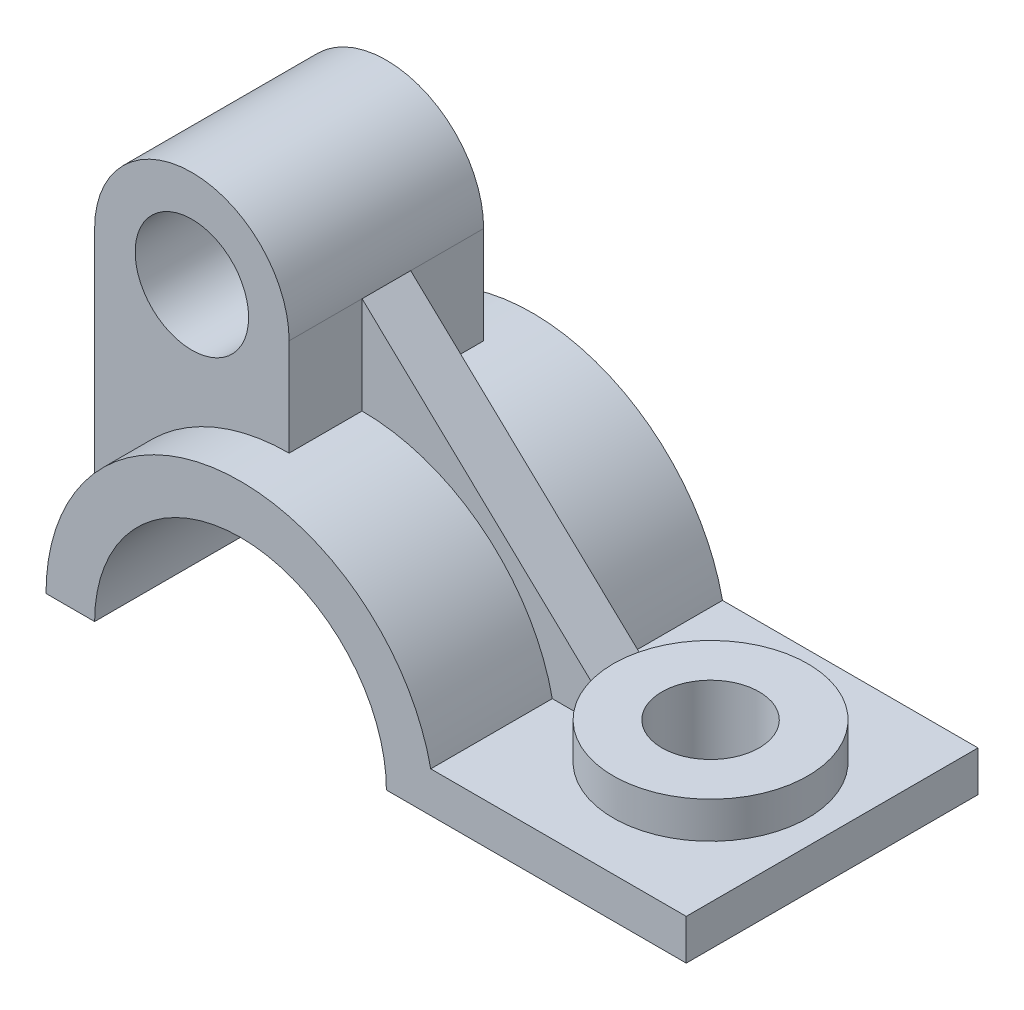
ISO-10303-21;
HEADER;
FILE_DESCRIPTION(('STEP AP214'),'2;1');
FILE_NAME('part.step','',(''),(''),'','','');
FILE_SCHEMA(('AUTOMOTIVE_DESIGN { 1 0 10303 214 1 1 1 1 }'));
ENDSEC;
DATA;
#1=APPLICATION_CONTEXT('core data for automotive mechanical design processes');
#2=APPLICATION_PROTOCOL_DEFINITION('international standard','automotive_design',2000,#1);
#3=PRODUCT_CONTEXT('',#1,'mechanical');
#4=PRODUCT('Part','Part','',(#3));
#5=PRODUCT_RELATED_PRODUCT_CATEGORY('part','',(#4));
#6=PRODUCT_DEFINITION_FORMATION('','',#4);
#7=PRODUCT_DEFINITION_CONTEXT('part definition',#1,'design');
#8=PRODUCT_DEFINITION('design','',#6,#7);
#9=PRODUCT_DEFINITION_SHAPE('','',#8);
#10=(LENGTH_UNIT() NAMED_UNIT(*) SI_UNIT(.MILLI.,.METRE.));
#11=(NAMED_UNIT(*) PLANE_ANGLE_UNIT() SI_UNIT($,.RADIAN.));
#12=(NAMED_UNIT(*) SI_UNIT($,.STERADIAN.) SOLID_ANGLE_UNIT());
#13=UNCERTAINTY_MEASURE_WITH_UNIT(LENGTH_MEASURE(1.E-05),#10,'distance_accuracy_value','');
#14=(GEOMETRIC_REPRESENTATION_CONTEXT(3) GLOBAL_UNCERTAINTY_ASSIGNED_CONTEXT((#13)) GLOBAL_UNIT_ASSIGNED_CONTEXT((#10,
#11,#12)) REPRESENTATION_CONTEXT('',''));
#15=CARTESIAN_POINT('',(0.,0.,0.));
#16=DIRECTION('',(0.,0.,1.));
#17=DIRECTION('',(1.,0.,0.));
#18=AXIS2_PLACEMENT_3D('',#15,#16,#17);
#19=CARTESIAN_POINT('',(0.,0.,18.));
#20=DIRECTION('',(0.,0.,-1.));
#21=DIRECTION('',(-1.,0.,0.));
#22=AXIS2_PLACEMENT_3D('',#19,#20,#21);
#23=CYLINDRICAL_SURFACE('',#22,24.);
#24=CARTESIAN_POINT('',(0.,0.,-3.));
#25=DIRECTION('',(0.,0.,1.));
#26=DIRECTION('',(1.,0.,0.));
#27=AXIS2_PLACEMENT_3D('',#24,#25,#26);
#28=CIRCLE('',#27,24.);
#29=CARTESIAN_POINT('',(23.473389188611,5.00000000000001,-3.));
#30=VERTEX_POINT('',#29);
#31=CARTESIAN_POINT('',(0.,24.,-3.));
#32=VERTEX_POINT('',#31);
#33=EDGE_CURVE('E60',#30,#32,#28,.T.);
#34=ORIENTED_EDGE('',*,*,#33,.F.);
#35=DIRECTION('',(0.,0.,-1.));
#36=VECTOR('',#35,1.);
#37=CARTESIAN_POINT('',(23.473389188611,5.00000000000001,18.));
#38=LINE('',#37,#36);
#39=CARTESIAN_POINT('',(23.473389188611,5.00000000000001,-18.));
#40=VERTEX_POINT('',#39);
#41=EDGE_CURVE('E166',#30,#40,#38,.T.);
#42=ORIENTED_EDGE('',*,*,#41,.T.);
#43=CARTESIAN_POINT('',(0.,0.,-18.));
#44=DIRECTION('',(0.,0.,1.));
#45=DIRECTION('',(1.,0.,0.));
#46=AXIS2_PLACEMENT_3D('',#43,#44,#45);
#47=CIRCLE('',#46,24.);
#48=CARTESIAN_POINT('',(-24.,0.,-18.));
#49=VERTEX_POINT('',#48);
#50=EDGE_CURVE('E203',#40,#49,#47,.T.);
#51=ORIENTED_EDGE('',*,*,#50,.T.);
#52=DIRECTION('',(0.,0.,-1.));
#53=VECTOR('',#52,1.);
#54=CARTESIAN_POINT('',(-24.,0.,18.));
#55=LINE('',#54,#53);
#56=CARTESIAN_POINT('',(-24.,0.,-12.));
#57=VERTEX_POINT('',#56);
#58=EDGE_CURVE('E180',#57,#49,#55,.T.);
#59=ORIENTED_EDGE('',*,*,#58,.F.);
#60=CARTESIAN_POINT('',(0.,0.,-12.));
#61=DIRECTION('',(0.,0.,1.));
#62=DIRECTION('',(1.,0.,0.));
#63=AXIS2_PLACEMENT_3D('',#60,#61,#62);
#64=CIRCLE('',#63,24.);
#65=CARTESIAN_POINT('',(0.,24.,-12.));
#66=VERTEX_POINT('',#65);
#67=EDGE_CURVE('E236',#66,#57,#64,.T.);
#68=ORIENTED_EDGE('',*,*,#67,.F.);
#69=DIRECTION('',(0.,0.,-1.));
#70=VECTOR('',#69,1.);
#71=CARTESIAN_POINT('',(0.,24.,12.));
#72=LINE('',#71,#70);
#73=EDGE_CURVE('E227',#32,#66,#72,.T.);
#74=ORIENTED_EDGE('',*,*,#73,.F.);
#75=EDGE_LOOP('',(#34,#42,#51,#59,#68,#74));
#76=FACE_BOUND('',#75,.T.);
#77=ADVANCED_FACE('F45',(#76),#23,.T.);
#78=CARTESIAN_POINT('',(0.,0.,12.));
#79=DIRECTION('',(1.,0.,0.));
#80=DIRECTION('',(0.,1.,0.));
#81=AXIS2_PLACEMENT_3D('',#78,#79,#80);
#82=PLANE('',#81);
#83=DIRECTION('',(0.,0.,-1.));
#84=VECTOR('',#83,1.);
#85=CARTESIAN_POINT('',(0.,36.,12.));
#86=LINE('',#85,#84);
#87=CARTESIAN_POINT('',(0.,36.,-3.));
#88=VERTEX_POINT('',#87);
#89=CARTESIAN_POINT('',(0.,36.,-12.));
#90=VERTEX_POINT('',#89);
#91=EDGE_CURVE('E231',#88,#90,#86,.T.);
#92=ORIENTED_EDGE('',*,*,#91,.F.);
#93=DIRECTION('',(0.,-1.,0.));
#94=VECTOR('',#93,1.);
#95=CARTESIAN_POINT('',(0.,0.,-3.));
#96=LINE('',#95,#94);
#97=EDGE_CURVE('E271',#88,#32,#96,.T.);
#98=ORIENTED_EDGE('',*,*,#97,.T.);
#99=ORIENTED_EDGE('',*,*,#73,.T.);
#100=DIRECTION('',(0.,-1.,0.));
#101=VECTOR('',#100,1.);
#102=CARTESIAN_POINT('',(0.,0.,-12.));
#103=LINE('',#102,#101);
#104=EDGE_CURVE('E232',#90,#66,#103,.T.);
#105=ORIENTED_EDGE('',*,*,#104,.F.);
#106=EDGE_LOOP('',(#92,#98,#99,#105));
#107=FACE_BOUND('',#106,.T.);
#108=ADVANCED_FACE('F355',(#107),#82,.T.);
#109=CARTESIAN_POINT('',(0.,5.00000000000001,18.));
#110=DIRECTION('',(0.,-1.,0.));
#111=DIRECTION('',(1.,0.,0.));
#112=AXIS2_PLACEMENT_3D('',#109,#110,#111);
#113=PLANE('',#112);
#114=CARTESIAN_POINT('',(40.,5.00000000000002,0.));
#115=DIRECTION('',(0.,-1.,0.));
#116=DIRECTION('',(1.,0.,0.));
#117=AXIS2_PLACEMENT_3D('',#114,#115,#116);
#118=CIRCLE('',#117,12.);
#119=CARTESIAN_POINT('',(28.3810499613777,5.00000000000001,3.));
#120=VERTEX_POINT('',#119);
#121=CARTESIAN_POINT('',(28.3810499613777,5.00000000000002,-3.));
#122=VERTEX_POINT('',#121);
#123=EDGE_CURVE('E155',#120,#122,#118,.F.);
#124=ORIENTED_EDGE('',*,*,#123,.F.);
#125=DIRECTION('',(-1.,0.,0.));
#126=VECTOR('',#125,1.);
#127=CARTESIAN_POINT('',(0.,5.00000000000001,3.));
#128=LINE('',#127,#126);
#129=CARTESIAN_POINT('',(23.473389188611,5.00000000000001,3.));
#130=VERTEX_POINT('',#129);
#131=EDGE_CURVE('E68',#120,#130,#128,.T.);
#132=ORIENTED_EDGE('',*,*,#131,.T.);
#133=CARTESIAN_POINT('',(23.473389188611,5.00000000000001,18.));
#134=VERTEX_POINT('',#133);
#135=EDGE_CURVE('E161',#134,#130,#38,.T.);
#136=ORIENTED_EDGE('',*,*,#135,.F.);
#137=DIRECTION('',(-1.,0.,0.));
#138=VECTOR('',#137,1.);
#139=CARTESIAN_POINT('',(0.,5.00000000000001,18.));
#140=LINE('',#139,#138);
#141=CARTESIAN_POINT('',(55.,5.00000000000002,18.));
#142=VERTEX_POINT('',#141);
#143=EDGE_CURVE('E194',#142,#134,#140,.T.);
#144=ORIENTED_EDGE('',*,*,#143,.F.);
#145=DIRECTION('',(0.,0.,-1.));
#146=VECTOR('',#145,1.);
#147=CARTESIAN_POINT('',(55.,5.00000000000002,18.));
#148=LINE('',#147,#146);
#149=CARTESIAN_POINT('',(55.,5.00000000000002,-18.));
#150=VERTEX_POINT('',#149);
#151=EDGE_CURVE('E188',#142,#150,#148,.T.);
#152=ORIENTED_EDGE('',*,*,#151,.T.);
#153=DIRECTION('',(-1.,0.,0.));
#154=VECTOR('',#153,1.);
#155=CARTESIAN_POINT('',(0.,5.00000000000001,-18.));
#156=LINE('',#155,#154);
#157=EDGE_CURVE('E206',#150,#40,#156,.T.);
#158=ORIENTED_EDGE('',*,*,#157,.T.);
#159=ORIENTED_EDGE('',*,*,#41,.F.);
#160=DIRECTION('',(-1.,0.,0.));
#161=VECTOR('',#160,1.);
#162=CARTESIAN_POINT('',(0.,5.00000000000001,-3.));
#163=LINE('',#162,#161);
#164=EDGE_CURVE('E164',#122,#30,#163,.T.);
#165=ORIENTED_EDGE('',*,*,#164,.F.);
#166=EDGE_LOOP('',(#124,#132,#136,#144,#152,#158,#159,#165));
#167=FACE_BOUND('',#166,.T.);
#168=ADVANCED_FACE('F47',(#167),#113,.F.);
#169=CARTESIAN_POINT('',(0.,0.,3.));
#170=DIRECTION('',(0.,0.,1.));
#171=DIRECTION('',(1.,0.,0.));
#172=AXIS2_PLACEMENT_3D('',#169,#170,#171);
#173=CIRCLE('',#172,24.);
#174=CARTESIAN_POINT('',(0.,24.,3.));
#175=VERTEX_POINT('',#174);
#176=EDGE_CURVE('E268',#130,#175,#173,.T.);
#177=ORIENTED_EDGE('',*,*,#176,.T.);
#178=CARTESIAN_POINT('',(0.,24.,12.));
#179=VERTEX_POINT('',#178);
#180=EDGE_CURVE('E224',#179,#175,#72,.T.);
#181=ORIENTED_EDGE('',*,*,#180,.F.);
#182=CARTESIAN_POINT('',(0.,0.,12.));
#183=DIRECTION('',(0.,0.,1.));
#184=DIRECTION('',(1.,0.,0.));
#185=AXIS2_PLACEMENT_3D('',#182,#183,#184);
#186=CIRCLE('',#185,24.);
#187=CARTESIAN_POINT('',(-24.,0.,12.));
#188=VERTEX_POINT('',#187);
#189=EDGE_CURVE('E252',#179,#188,#186,.T.);
#190=ORIENTED_EDGE('',*,*,#189,.T.);
#191=CARTESIAN_POINT('',(-24.,0.,18.));
#192=VERTEX_POINT('',#191);
#193=EDGE_CURVE('E177',#192,#188,#55,.T.);
#194=ORIENTED_EDGE('',*,*,#193,.F.);
#195=CARTESIAN_POINT('',(0.,0.,18.));
#196=DIRECTION('',(0.,0.,1.));
#197=DIRECTION('',(1.,0.,0.));
#198=AXIS2_PLACEMENT_3D('',#195,#196,#197);
#199=CIRCLE('',#198,24.);
#200=EDGE_CURVE('E217',#134,#192,#199,.T.);
#201=ORIENTED_EDGE('',*,*,#200,.F.);
#202=ORIENTED_EDGE('',*,*,#135,.T.);
#203=EDGE_LOOP('',(#177,#181,#190,#194,#201,#202));
#204=FACE_BOUND('',#203,.T.);
#205=ADVANCED_FACE('F307',(#204),#23,.T.);
#206=CARTESIAN_POINT('',(0.,0.,18.));
#207=DIRECTION('',(0.,1.,0.));
#208=DIRECTION('',(-1.,0.,0.));
#209=AXIS2_PLACEMENT_3D('',#206,#207,#208);
#210=PLANE('',#209);
#211=DIRECTION('',(0.,0.,-1.));
#212=VECTOR('',#211,1.);
#213=CARTESIAN_POINT('',(-24.,0.,12.));
#214=LINE('',#213,#212);
#215=EDGE_CURVE('E222',#188,#57,#214,.T.);
#216=ORIENTED_EDGE('',*,*,#215,.T.);
#217=ORIENTED_EDGE('',*,*,#58,.T.);
#218=DIRECTION('',(1.,0.,0.));
#219=VECTOR('',#218,1.);
#220=CARTESIAN_POINT('',(0.,0.,-18.));
#221=LINE('',#220,#219);
#222=CARTESIAN_POINT('',(-18.,0.,-18.));
#223=VERTEX_POINT('',#222);
#224=EDGE_CURVE('E200',#49,#223,#221,.T.);
#225=ORIENTED_EDGE('',*,*,#224,.T.);
#226=DIRECTION('',(0.,0.,-1.));
#227=VECTOR('',#226,1.);
#228=CARTESIAN_POINT('',(-18.,0.,18.));
#229=LINE('',#228,#227);
#230=CARTESIAN_POINT('',(-18.,0.,18.));
#231=VERTEX_POINT('',#230);
#232=EDGE_CURVE('E181',#231,#223,#229,.T.);
#233=ORIENTED_EDGE('',*,*,#232,.F.);
#234=DIRECTION('',(1.,0.,0.));
#235=VECTOR('',#234,1.);
#236=CARTESIAN_POINT('',(0.,0.,18.));
#237=LINE('',#236,#235);
#238=EDGE_CURVE('E215',#192,#231,#237,.T.);
#239=ORIENTED_EDGE('',*,*,#238,.F.);
#240=ORIENTED_EDGE('',*,*,#193,.T.);
#241=EDGE_LOOP('',(#216,#217,#225,#233,#239,#240));
#242=FACE_BOUND('',#241,.T.);
#243=ADVANCED_FACE('F318',(#242),#210,.F.);
#244=CARTESIAN_POINT('',(0.,0.,18.));
#245=DIRECTION('',(0.,0.,-1.));
#246=DIRECTION('',(-1.,0.,0.));
#247=AXIS2_PLACEMENT_3D('',#244,#245,#246);
#248=CYLINDRICAL_SURFACE('',#247,18.);
#249=ORIENTED_EDGE('',*,*,#232,.T.);
#250=CARTESIAN_POINT('',(0.,0.,-18.));
#251=DIRECTION('',(0.,0.,1.));
#252=DIRECTION('',(1.,0.,0.));
#253=AXIS2_PLACEMENT_3D('',#250,#251,#252);
#254=CIRCLE('',#253,18.);
#255=CARTESIAN_POINT('',(18.,0.,-18.));
#256=VERTEX_POINT('',#255);
#257=EDGE_CURVE('E197',#256,#223,#254,.T.);
#258=ORIENTED_EDGE('',*,*,#257,.F.);
#259=DIRECTION('',(0.,0.,-1.));
#260=VECTOR('',#259,1.);
#261=CARTESIAN_POINT('',(18.,0.,18.));
#262=LINE('',#261,#260);
#263=CARTESIAN_POINT('',(18.,0.,18.));
#264=VERTEX_POINT('',#263);
#265=EDGE_CURVE('E183',#264,#256,#262,.T.);
#266=ORIENTED_EDGE('',*,*,#265,.F.);
#267=CARTESIAN_POINT('',(0.,0.,18.));
#268=DIRECTION('',(0.,0.,1.));
#269=DIRECTION('',(1.,0.,0.));
#270=AXIS2_PLACEMENT_3D('',#267,#268,#269);
#271=CIRCLE('',#270,18.);
#272=EDGE_CURVE('E212',#264,#231,#271,.T.);
#273=ORIENTED_EDGE('',*,*,#272,.T.);
#274=EDGE_LOOP('',(#249,#258,#266,#273));
#275=FACE_BOUND('',#274,.T.);
#276=ADVANCED_FACE('F338',(#275),#248,.F.);
#277=CARTESIAN_POINT('',(0.,0.,18.));
#278=DIRECTION('',(0.,1.,0.));
#279=DIRECTION('',(-1.,0.,0.));
#280=AXIS2_PLACEMENT_3D('',#277,#278,#279);
#281=PLANE('',#280);
#282=CARTESIAN_POINT('',(40.,0.,0.));
#283=DIRECTION('',(0.,1.,0.));
#284=DIRECTION('',(0.,0.,1.));
#285=AXIS2_PLACEMENT_3D('',#282,#283,#284);
#286=CIRCLE('',#285,6.);
#287=CARTESIAN_POINT('',(40.,0.,6.));
#288=VERTEX_POINT('',#287);
#289=EDGE_CURVE('E281',#288,#288,#286,.T.);
#290=ORIENTED_EDGE('',*,*,#289,.T.);
#291=EDGE_LOOP('',(#290));
#292=FACE_BOUND('',#291,.T.);
#293=ORIENTED_EDGE('',*,*,#265,.T.);
#294=DIRECTION('',(1.,0.,0.));
#295=VECTOR('',#294,1.);
#296=CARTESIAN_POINT('',(0.,0.,-18.));
#297=LINE('',#296,#295);
#298=CARTESIAN_POINT('',(55.,0.,-18.));
#299=VERTEX_POINT('',#298);
#300=EDGE_CURVE('E195',#256,#299,#297,.T.);
#301=ORIENTED_EDGE('',*,*,#300,.T.);
#302=DIRECTION('',(0.,0.,-1.));
#303=VECTOR('',#302,1.);
#304=CARTESIAN_POINT('',(55.,0.,18.));
#305=LINE('',#304,#303);
#306=CARTESIAN_POINT('',(55.,0.,18.));
#307=VERTEX_POINT('',#306);
#308=EDGE_CURVE('E185',#307,#299,#305,.T.);
#309=ORIENTED_EDGE('',*,*,#308,.F.);
#310=DIRECTION('',(1.,0.,0.));
#311=VECTOR('',#310,1.);
#312=CARTESIAN_POINT('',(0.,0.,18.));
#313=LINE('',#312,#311);
#314=EDGE_CURVE('E210',#264,#307,#313,.T.);
#315=ORIENTED_EDGE('',*,*,#314,.F.);
#316=EDGE_LOOP('',(#293,#301,#309,#315));
#317=FACE_BOUND('',#316,.T.);
#318=ADVANCED_FACE('F342',(#292,#317),#281,.F.);
#319=CARTESIAN_POINT('',(55.,0.,18.));
#320=DIRECTION('',(-1.,0.,0.));
#321=DIRECTION('',(0.,0.,1.));
#322=AXIS2_PLACEMENT_3D('',#319,#320,#321);
#323=PLANE('',#322);
#324=DIRECTION('',(0.,1.,0.));
#325=VECTOR('',#324,1.);
#326=CARTESIAN_POINT('',(55.,0.,-18.));
#327=LINE('',#326,#325);
#328=EDGE_CURVE('E192',#299,#150,#327,.T.);
#329=ORIENTED_EDGE('',*,*,#328,.T.);
#330=ORIENTED_EDGE('',*,*,#151,.F.);
#331=DIRECTION('',(0.,1.,0.));
#332=VECTOR('',#331,1.);
#333=CARTESIAN_POINT('',(55.,0.,18.));
#334=LINE('',#333,#332);
#335=EDGE_CURVE('E191',#307,#142,#334,.T.);
#336=ORIENTED_EDGE('',*,*,#335,.F.);
#337=ORIENTED_EDGE('',*,*,#308,.T.);
#338=EDGE_LOOP('',(#329,#330,#336,#337));
#339=FACE_BOUND('',#338,.T.);
#340=ADVANCED_FACE('F343',(#339),#323,.F.);
#341=CARTESIAN_POINT('',(0.,0.,18.));
#342=DIRECTION('',(0.,0.,1.));
#343=DIRECTION('',(1.,0.,0.));
#344=AXIS2_PLACEMENT_3D('',#341,#342,#343);
#345=PLANE('',#344);
#346=ORIENTED_EDGE('',*,*,#143,.T.);
#347=ORIENTED_EDGE('',*,*,#200,.T.);
#348=ORIENTED_EDGE('',*,*,#238,.T.);
#349=ORIENTED_EDGE('',*,*,#272,.F.);
#350=ORIENTED_EDGE('',*,*,#314,.T.);
#351=ORIENTED_EDGE('',*,*,#335,.T.);
#352=EDGE_LOOP('',(#346,#347,#348,#349,#350,#351));
#353=FACE_BOUND('',#352,.T.);
#354=ADVANCED_FACE('F322',(#353),#345,.T.);
#355=CARTESIAN_POINT('',(0.,0.,-18.));
#356=DIRECTION('',(0.,0.,1.));
#357=DIRECTION('',(1.,0.,0.));
#358=AXIS2_PLACEMENT_3D('',#355,#356,#357);
#359=PLANE('',#358);
#360=ORIENTED_EDGE('',*,*,#157,.F.);
#361=ORIENTED_EDGE('',*,*,#328,.F.);
#362=ORIENTED_EDGE('',*,*,#300,.F.);
#363=ORIENTED_EDGE('',*,*,#257,.T.);
#364=ORIENTED_EDGE('',*,*,#224,.F.);
#365=ORIENTED_EDGE('',*,*,#50,.F.);
#366=EDGE_LOOP('',(#360,#361,#362,#363,#364,#365));
#367=FACE_BOUND('',#366,.T.);
#368=ADVANCED_FACE('F331',(#367),#359,.F.);
#369=CARTESIAN_POINT('',(-12.,36.,12.));
#370=DIRECTION('',(0.,0.,-1.));
#371=DIRECTION('',(-1.,0.,0.));
#372=AXIS2_PLACEMENT_3D('',#369,#370,#371);
#373=CYLINDRICAL_SURFACE('',#372,12.);
#374=CARTESIAN_POINT('',(-12.,36.,-12.));
#375=DIRECTION('',(0.,0.,1.));
#376=DIRECTION('',(1.,0.,0.));
#377=AXIS2_PLACEMENT_3D('',#374,#375,#376);
#378=CIRCLE('',#377,12.);
#379=CARTESIAN_POINT('',(-24.,36.,-12.));
#380=VERTEX_POINT('',#379);
#381=EDGE_CURVE('E242',#380,#90,#378,.F.);
#382=ORIENTED_EDGE('',*,*,#381,.F.);
#383=DIRECTION('',(0.,0.,-1.));
#384=VECTOR('',#383,1.);
#385=CARTESIAN_POINT('',(-24.,36.,12.));
#386=LINE('',#385,#384);
#387=CARTESIAN_POINT('',(-24.,36.,12.));
#388=VERTEX_POINT('',#387);
#389=EDGE_CURVE('E208',#388,#380,#386,.T.);
#390=ORIENTED_EDGE('',*,*,#389,.F.);
#391=CARTESIAN_POINT('',(-12.,36.,12.));
#392=DIRECTION('',(0.,0.,1.));
#393=DIRECTION('',(1.,0.,0.));
#394=AXIS2_PLACEMENT_3D('',#391,#392,#393);
#395=CIRCLE('',#394,12.);
#396=CARTESIAN_POINT('',(0.,36.,12.));
#397=VERTEX_POINT('',#396);
#398=EDGE_CURVE('E258',#388,#397,#395,.F.);
#399=ORIENTED_EDGE('',*,*,#398,.T.);
#400=CARTESIAN_POINT('',(0.,36.,3.));
#401=VERTEX_POINT('',#400);
#402=EDGE_CURVE('E228',#397,#401,#86,.T.);
#403=ORIENTED_EDGE('',*,*,#402,.T.);
#404=DIRECTION('',(0.,0.,-1.));
#405=VECTOR('',#404,1.);
#406=CARTESIAN_POINT('',(0.,36.,12.));
#407=LINE('',#406,#405);
#408=EDGE_CURVE('E168',#88,#401,#407,.F.);
#409=ORIENTED_EDGE('',*,*,#408,.F.);
#410=ORIENTED_EDGE('',*,*,#91,.T.);
#411=EDGE_LOOP('',(#382,#390,#399,#403,#409,#410));
#412=FACE_BOUND('',#411,.T.);
#413=ADVANCED_FACE('F443',(#412),#373,.T.);
#414=CARTESIAN_POINT('',(-24.,0.,12.));
#415=DIRECTION('',(-1.,0.,0.));
#416=DIRECTION('',(0.,0.,1.));
#417=AXIS2_PLACEMENT_3D('',#414,#415,#416);
#418=PLANE('',#417);
#419=ORIENTED_EDGE('',*,*,#389,.T.);
#420=DIRECTION('',(0.,1.,0.));
#421=VECTOR('',#420,1.);
#422=CARTESIAN_POINT('',(-24.,0.,-12.));
#423=LINE('',#422,#421);
#424=EDGE_CURVE('E239',#57,#380,#423,.T.);
#425=ORIENTED_EDGE('',*,*,#424,.F.);
#426=ORIENTED_EDGE('',*,*,#215,.F.);
#427=DIRECTION('',(0.,1.,0.));
#428=VECTOR('',#427,1.);
#429=CARTESIAN_POINT('',(-24.,0.,12.));
#430=LINE('',#429,#428);
#431=EDGE_CURVE('E255',#188,#388,#430,.T.);
#432=ORIENTED_EDGE('',*,*,#431,.T.);
#433=EDGE_LOOP('',(#419,#425,#426,#432));
#434=FACE_BOUND('',#433,.T.);
#435=ADVANCED_FACE('F434',(#434),#418,.T.);
#436=CARTESIAN_POINT('',(-12.,36.,12.));
#437=DIRECTION('',(0.,0.,-1.));
#438=DIRECTION('',(-1.,0.,0.));
#439=AXIS2_PLACEMENT_3D('',#436,#437,#438);
#440=CYLINDRICAL_SURFACE('',#439,7.);
#441=CARTESIAN_POINT('',(-12.,36.,12.));
#442=DIRECTION('',(0.,0.,1.));
#443=DIRECTION('',(1.,0.,0.));
#444=AXIS2_PLACEMENT_3D('',#441,#442,#443);
#445=CIRCLE('',#444,7.);
#446=CARTESIAN_POINT('',(-5.,36.,12.));
#447=VERTEX_POINT('',#446);
#448=EDGE_CURVE('E235',#447,#447,#445,.T.);
#449=ORIENTED_EDGE('',*,*,#448,.T.);
#450=EDGE_LOOP('',(#449));
#451=FACE_BOUND('',#450,.T.);
#452=CARTESIAN_POINT('',(-12.,36.,-12.));
#453=DIRECTION('',(0.,0.,1.));
#454=DIRECTION('',(1.,0.,0.));
#455=AXIS2_PLACEMENT_3D('',#452,#453,#454);
#456=CIRCLE('',#455,7.);
#457=CARTESIAN_POINT('',(-5.,36.,-12.));
#458=VERTEX_POINT('',#457);
#459=EDGE_CURVE('E245',#458,#458,#456,.T.);
#460=ORIENTED_EDGE('',*,*,#459,.F.);
#461=EDGE_LOOP('',(#460));
#462=FACE_BOUND('',#461,.T.);
#463=ADVANCED_FACE('F426',(#451,#462),#440,.F.);
#464=DIRECTION('',(0.,-1.,0.));
#465=VECTOR('',#464,1.);
#466=CARTESIAN_POINT('',(0.,0.,3.));
#467=LINE('',#466,#465);
#468=EDGE_CURVE('E265',#401,#175,#467,.T.);
#469=ORIENTED_EDGE('',*,*,#468,.F.);
#470=ORIENTED_EDGE('',*,*,#402,.F.);
#471=DIRECTION('',(0.,-1.,0.));
#472=VECTOR('',#471,1.);
#473=CARTESIAN_POINT('',(0.,0.,12.));
#474=LINE('',#473,#472);
#475=EDGE_CURVE('E249',#397,#179,#474,.T.);
#476=ORIENTED_EDGE('',*,*,#475,.T.);
#477=ORIENTED_EDGE('',*,*,#180,.T.);
#478=EDGE_LOOP('',(#469,#470,#476,#477));
#479=FACE_BOUND('',#478,.T.);
#480=ADVANCED_FACE('F309',(#479),#82,.T.);
#481=CARTESIAN_POINT('',(0.,0.,12.));
#482=DIRECTION('',(0.,0.,1.));
#483=DIRECTION('',(1.,0.,0.));
#484=AXIS2_PLACEMENT_3D('',#481,#482,#483);
#485=PLANE('',#484);
#486=ORIENTED_EDGE('',*,*,#448,.F.);
#487=EDGE_LOOP('',(#486));
#488=FACE_BOUND('',#487,.T.);
#489=ORIENTED_EDGE('',*,*,#398,.F.);
#490=ORIENTED_EDGE('',*,*,#431,.F.);
#491=ORIENTED_EDGE('',*,*,#189,.F.);
#492=ORIENTED_EDGE('',*,*,#475,.F.);
#493=EDGE_LOOP('',(#489,#490,#491,#492));
#494=FACE_BOUND('',#493,.T.);
#495=ADVANCED_FACE('F313',(#488,#494),#485,.T.);
#496=CARTESIAN_POINT('',(0.,0.,-12.));
#497=DIRECTION('',(0.,0.,1.));
#498=DIRECTION('',(1.,0.,0.));
#499=AXIS2_PLACEMENT_3D('',#496,#497,#498);
#500=PLANE('',#499);
#501=ORIENTED_EDGE('',*,*,#459,.T.);
#502=EDGE_LOOP('',(#501));
#503=FACE_BOUND('',#502,.T.);
#504=ORIENTED_EDGE('',*,*,#381,.T.);
#505=ORIENTED_EDGE('',*,*,#104,.T.);
#506=ORIENTED_EDGE('',*,*,#67,.T.);
#507=ORIENTED_EDGE('',*,*,#424,.T.);
#508=EDGE_LOOP('',(#504,#505,#506,#507));
#509=FACE_BOUND('',#508,.T.);
#510=ADVANCED_FACE('F418',(#503,#509),#500,.F.);
#511=CARTESIAN_POINT('',(40.,9.50000000000002,0.));
#512=DIRECTION('',(0.,-1.,0.));
#513=DIRECTION('',(1.,0.,0.));
#514=AXIS2_PLACEMENT_3D('',#511,#512,#513);
#515=CYLINDRICAL_SURFACE('',#514,12.);
#516=CARTESIAN_POINT('',(40.,-1.85714285714284,0.));
#517=DIRECTION('',(-0.68738482481996,-0.726293399809769,0.));
#518=DIRECTION('',(0.726293399809769,-0.68738482481996,0.));
#519=AXIS2_PLACEMENT_3D('',#516,#517,#518);
#520=ELLIPSE('',#519,16.5222484510296,12.);
#521=CARTESIAN_POINT('',(28.,9.50000000000001,0.));
#522=VERTEX_POINT('',#521);
#523=CARTESIAN_POINT('',(28.3810499613777,9.13936342941036,3.));
#524=VERTEX_POINT('',#523);
#525=EDGE_CURVE('E277',#522,#524,#520,.F.);
#526=ORIENTED_EDGE('',*,*,#525,.T.);
#527=DIRECTION('',(0.,-1.,0.));
#528=VECTOR('',#527,1.);
#529=CARTESIAN_POINT('',(28.3810499613777,9.50000000000001,3.));
#530=LINE('',#529,#528);
#531=EDGE_CURVE('E11',#524,#120,#530,.T.);
#532=ORIENTED_EDGE('',*,*,#531,.T.);
#533=ORIENTED_EDGE('',*,*,#123,.T.);
#534=DIRECTION('',(0.,-1.,0.));
#535=VECTOR('',#534,1.);
#536=CARTESIAN_POINT('',(28.3810499613777,9.50000000000001,-3.));
#537=LINE('',#536,#535);
#538=CARTESIAN_POINT('',(28.3810499613777,9.13936342941036,-3.));
#539=VERTEX_POINT('',#538);
#540=EDGE_CURVE('E53',#539,#122,#537,.T.);
#541=ORIENTED_EDGE('',*,*,#540,.F.);
#542=EDGE_CURVE('E276',#539,#522,#520,.F.);
#543=ORIENTED_EDGE('',*,*,#542,.T.);
#544=CARTESIAN_POINT('',(40.,9.50000000000002,0.));
#545=DIRECTION('',(0.,1.,0.));
#546=DIRECTION('',(-1.,0.,0.));
#547=AXIS2_PLACEMENT_3D('',#544,#545,#546);
#548=CIRCLE('',#547,12.);
#549=EDGE_CURVE('E248',#522,#522,#548,.T.);
#550=ORIENTED_EDGE('',*,*,#549,.F.);
#551=EDGE_LOOP('',(#526,#532,#533,#541,#543,#550));
#552=FACE_BOUND('',#551,.T.);
#553=ADVANCED_FACE('F157',(#552),#515,.T.);
#554=CARTESIAN_POINT('',(40.,9.50000000000002,0.));
#555=DIRECTION('',(0.,1.,0.));
#556=DIRECTION('',(-1.,0.,0.));
#557=AXIS2_PLACEMENT_3D('',#554,#555,#556);
#558=PLANE('',#557);
#559=CARTESIAN_POINT('',(40.,9.50000000000002,0.));
#560=DIRECTION('',(0.,1.,0.));
#561=DIRECTION('',(0.,0.,1.));
#562=AXIS2_PLACEMENT_3D('',#559,#560,#561);
#563=CIRCLE('',#562,6.);
#564=CARTESIAN_POINT('',(40.,9.50000000000002,6.));
#565=VERTEX_POINT('',#564);
#566=EDGE_CURVE('E286',#565,#565,#563,.T.);
#567=ORIENTED_EDGE('',*,*,#566,.F.);
#568=EDGE_LOOP('',(#567));
#569=FACE_BOUND('',#568,.T.);
#570=ORIENTED_EDGE('',*,*,#549,.T.);
#571=EDGE_LOOP('',(#570));
#572=FACE_BOUND('',#571,.T.);
#573=ADVANCED_FACE('F292',(#569,#572),#558,.T.);
#574=CARTESIAN_POINT('',(0.,36.,0.));
#575=DIRECTION('',(-0.68738482481996,-0.726293399809769,0.));
#576=DIRECTION('',(0.726293399809769,-0.68738482481996,0.));
#577=AXIS2_PLACEMENT_3D('',#574,#575,#576);
#578=PLANE('',#577);
#579=DIRECTION('',(0.726293399809769,-0.68738482481996,0.));
#580=VECTOR('',#579,1.);
#581=CARTESIAN_POINT('',(0.,36.,-3.));
#582=LINE('',#581,#580);
#583=EDGE_CURVE('E174',#88,#539,#582,.T.);
#584=ORIENTED_EDGE('',*,*,#583,.F.);
#585=ORIENTED_EDGE('',*,*,#408,.T.);
#586=DIRECTION('',(0.726293399809769,-0.68738482481996,0.));
#587=VECTOR('',#586,1.);
#588=CARTESIAN_POINT('',(0.,36.,3.));
#589=LINE('',#588,#587);
#590=EDGE_CURVE('E279',#401,#524,#589,.T.);
#591=ORIENTED_EDGE('',*,*,#590,.T.);
#592=ORIENTED_EDGE('',*,*,#525,.F.);
#593=ORIENTED_EDGE('',*,*,#542,.F.);
#594=EDGE_LOOP('',(#584,#585,#591,#592,#593));
#595=FACE_BOUND('',#594,.T.);
#596=ADVANCED_FACE('F295',(#595),#578,.F.);
#597=CARTESIAN_POINT('',(15.5,24.,3.));
#598=DIRECTION('',(0.,0.,1.));
#599=DIRECTION('',(1.,0.,0.));
#600=AXIS2_PLACEMENT_3D('',#597,#598,#599);
#601=PLANE('',#600);
#602=ORIENTED_EDGE('',*,*,#468,.T.);
#603=ORIENTED_EDGE('',*,*,#176,.F.);
#604=ORIENTED_EDGE('',*,*,#131,.F.);
#605=ORIENTED_EDGE('',*,*,#531,.F.);
#606=ORIENTED_EDGE('',*,*,#590,.F.);
#607=EDGE_LOOP('',(#602,#603,#604,#605,#606));
#608=FACE_BOUND('',#607,.T.);
#609=ADVANCED_FACE('F303',(#608),#601,.T.);
#610=CARTESIAN_POINT('',(15.5,24.,-3.));
#611=DIRECTION('',(0.,0.,1.));
#612=DIRECTION('',(1.,0.,0.));
#613=AXIS2_PLACEMENT_3D('',#610,#611,#612);
#614=PLANE('',#613);
#615=ORIENTED_EDGE('',*,*,#97,.F.);
#616=ORIENTED_EDGE('',*,*,#583,.T.);
#617=ORIENTED_EDGE('',*,*,#540,.T.);
#618=ORIENTED_EDGE('',*,*,#164,.T.);
#619=ORIENTED_EDGE('',*,*,#33,.T.);
#620=EDGE_LOOP('',(#615,#616,#617,#618,#619));
#621=FACE_BOUND('',#620,.T.);
#622=ADVANCED_FACE('F172',(#621),#614,.F.);
#623=CARTESIAN_POINT('',(40.,9.50000000000002,0.));
#624=DIRECTION('',(0.,1.,0.));
#625=DIRECTION('',(0.,0.,1.));
#626=AXIS2_PLACEMENT_3D('',#623,#624,#625);
#627=CYLINDRICAL_SURFACE('',#626,6.);
#628=ORIENTED_EDGE('',*,*,#289,.F.);
#629=EDGE_LOOP('',(#628));
#630=FACE_BOUND('',#629,.T.);
#631=ORIENTED_EDGE('',*,*,#566,.T.);
#632=EDGE_LOOP('',(#631));
#633=FACE_BOUND('',#632,.T.);
#634=ADVANCED_FACE('F290',(#630,#633),#627,.F.);
#635=CLOSED_SHELL('',(#77,#108,#168,#205,#243,#276,#318,#340,#354,#368,#413,#435,#463,#480,#495,
#510,#553,#573,#596,#609,#622,#634));
#636=MANIFOLD_SOLID_BREP('B2',#635);
#637=ADVANCED_BREP_SHAPE_REPRESENTATION('',(#18,#636),#14);
#638=SHAPE_DEFINITION_REPRESENTATION(#9,#637);
ENDSEC;
END-ISO-10303-21;
